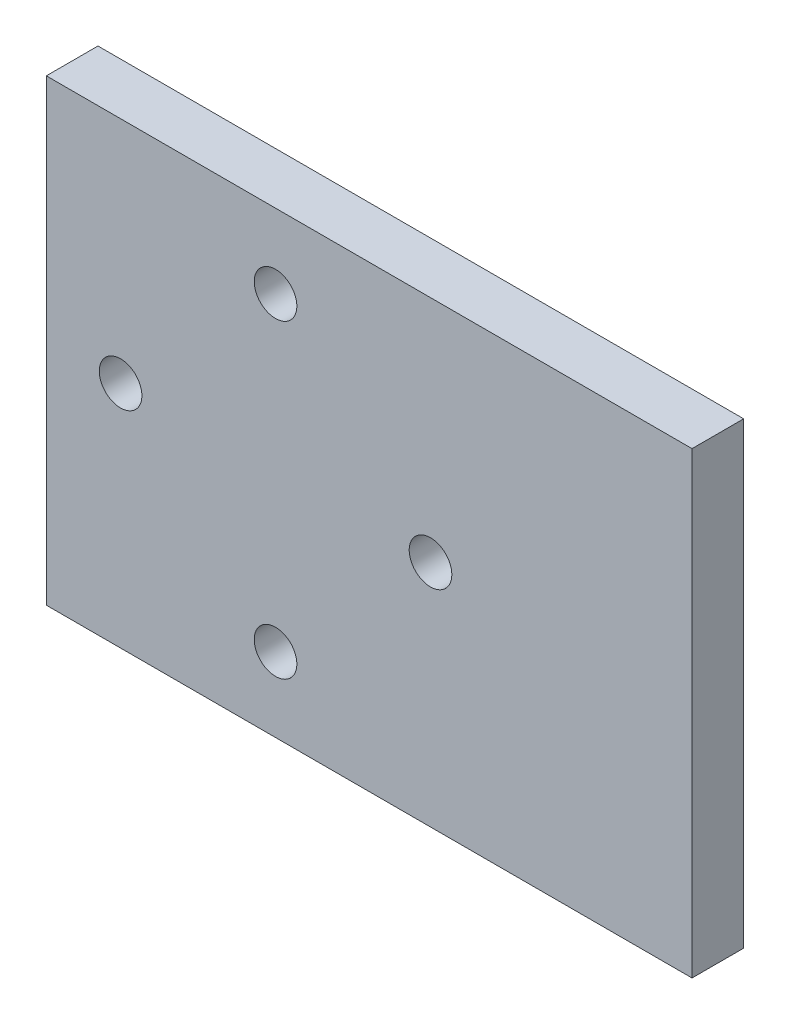
ISO-10303-21;
HEADER;
FILE_DESCRIPTION(('STEP AP214'),'2;1');
FILE_NAME('part.step','',(''),(''),'','','');
FILE_SCHEMA(('AUTOMOTIVE_DESIGN { 1 0 10303 214 1 1 1 1 }'));
ENDSEC;
DATA;
#1=APPLICATION_CONTEXT('core data for automotive mechanical design processes');
#2=APPLICATION_PROTOCOL_DEFINITION('international standard','automotive_design',2000,#1);
#3=PRODUCT_CONTEXT('',#1,'mechanical');
#4=PRODUCT('Part','Part','',(#3));
#5=PRODUCT_RELATED_PRODUCT_CATEGORY('part','',(#4));
#6=PRODUCT_DEFINITION_FORMATION('','',#4);
#7=PRODUCT_DEFINITION_CONTEXT('part definition',#1,'design');
#8=PRODUCT_DEFINITION('design','',#6,#7);
#9=PRODUCT_DEFINITION_SHAPE('','',#8);
#10=(LENGTH_UNIT() NAMED_UNIT(*) SI_UNIT(.MILLI.,.METRE.));
#11=(NAMED_UNIT(*) PLANE_ANGLE_UNIT() SI_UNIT($,.RADIAN.));
#12=(NAMED_UNIT(*) SI_UNIT($,.STERADIAN.) SOLID_ANGLE_UNIT());
#13=UNCERTAINTY_MEASURE_WITH_UNIT(LENGTH_MEASURE(1.E-05),#10,'distance_accuracy_value','');
#14=(GEOMETRIC_REPRESENTATION_CONTEXT(3) GLOBAL_UNCERTAINTY_ASSIGNED_CONTEXT((#13)) GLOBAL_UNIT_ASSIGNED_CONTEXT((#10,
#11,#12)) REPRESENTATION_CONTEXT('',''));
#15=CARTESIAN_POINT('',(0.,0.,0.));
#16=DIRECTION('',(0.,0.,1.));
#17=DIRECTION('',(1.,0.,0.));
#18=AXIS2_PLACEMENT_3D('',#15,#16,#17);
#19=CARTESIAN_POINT('',(50.,35.5,8.));
#20=DIRECTION('',(-1.,0.,0.));
#21=DIRECTION('',(0.,0.,1.));
#22=AXIS2_PLACEMENT_3D('',#19,#20,#21);
#23=PLANE('',#22);
#24=DIRECTION('',(0.,1.,0.));
#25=VECTOR('',#24,1.);
#26=CARTESIAN_POINT('',(50.,35.5,0.));
#27=LINE('',#26,#25);
#28=CARTESIAN_POINT('',(50.,-35.5,0.));
#29=VERTEX_POINT('',#28);
#30=CARTESIAN_POINT('',(50.,35.5,0.));
#31=VERTEX_POINT('',#30);
#32=EDGE_CURVE('E98',#29,#31,#27,.T.);
#33=ORIENTED_EDGE('',*,*,#32,.T.);
#34=DIRECTION('',(0.,0.,-1.));
#35=VECTOR('',#34,1.);
#36=CARTESIAN_POINT('',(50.,35.5,8.));
#37=LINE('',#36,#35);
#38=CARTESIAN_POINT('',(50.,35.5,8.));
#39=VERTEX_POINT('',#38);
#40=EDGE_CURVE('E11',#39,#31,#37,.T.);
#41=ORIENTED_EDGE('',*,*,#40,.F.);
#42=DIRECTION('',(0.,1.,0.));
#43=VECTOR('',#42,1.);
#44=CARTESIAN_POINT('',(50.,35.5,8.));
#45=LINE('',#44,#43);
#46=CARTESIAN_POINT('',(50.,-35.5,8.));
#47=VERTEX_POINT('',#46);
#48=EDGE_CURVE('E86',#47,#39,#45,.T.);
#49=ORIENTED_EDGE('',*,*,#48,.F.);
#50=DIRECTION('',(0.,0.,-1.));
#51=VECTOR('',#50,1.);
#52=CARTESIAN_POINT('',(50.,-35.5,8.));
#53=LINE('',#52,#51);
#54=EDGE_CURVE('E94',#47,#29,#53,.T.);
#55=ORIENTED_EDGE('',*,*,#54,.T.);
#56=EDGE_LOOP('',(#33,#41,#49,#55));
#57=FACE_BOUND('',#56,.T.);
#58=ADVANCED_FACE('F35',(#57),#23,.F.);
#59=CARTESIAN_POINT('',(-50.,35.5,8.));
#60=DIRECTION('',(0.,-1.,0.));
#61=DIRECTION('',(0.,0.,-1.));
#62=AXIS2_PLACEMENT_3D('',#59,#60,#61);
#63=PLANE('',#62);
#64=DIRECTION('',(-1.,0.,0.));
#65=VECTOR('',#64,1.);
#66=CARTESIAN_POINT('',(-50.,35.5,0.));
#67=LINE('',#66,#65);
#68=CARTESIAN_POINT('',(-50.,35.5,0.));
#69=VERTEX_POINT('',#68);
#70=EDGE_CURVE('E90',#31,#69,#67,.T.);
#71=ORIENTED_EDGE('',*,*,#70,.T.);
#72=DIRECTION('',(0.,0.,-1.));
#73=VECTOR('',#72,1.);
#74=CARTESIAN_POINT('',(-50.,35.5,8.));
#75=LINE('',#74,#73);
#76=CARTESIAN_POINT('',(-50.,35.5,8.));
#77=VERTEX_POINT('',#76);
#78=EDGE_CURVE('E43',#77,#69,#75,.T.);
#79=ORIENTED_EDGE('',*,*,#78,.F.);
#80=DIRECTION('',(-1.,0.,0.));
#81=VECTOR('',#80,1.);
#82=CARTESIAN_POINT('',(-50.,35.5,8.));
#83=LINE('',#82,#81);
#84=EDGE_CURVE('E81',#39,#77,#83,.T.);
#85=ORIENTED_EDGE('',*,*,#84,.F.);
#86=ORIENTED_EDGE('',*,*,#40,.T.);
#87=EDGE_LOOP('',(#71,#79,#85,#86));
#88=FACE_BOUND('',#87,.T.);
#89=ADVANCED_FACE('F89',(#88),#63,.F.);
#90=CARTESIAN_POINT('',(-50.,35.5,8.));
#91=DIRECTION('',(1.,0.,0.));
#92=DIRECTION('',(0.,0.,-1.));
#93=AXIS2_PLACEMENT_3D('',#90,#91,#92);
#94=PLANE('',#93);
#95=DIRECTION('',(0.,-1.,0.));
#96=VECTOR('',#95,1.);
#97=CARTESIAN_POINT('',(-50.,35.5,0.));
#98=LINE('',#97,#96);
#99=CARTESIAN_POINT('',(-50.,-35.5,0.));
#100=VERTEX_POINT('',#99);
#101=EDGE_CURVE('E68',#69,#100,#98,.T.);
#102=ORIENTED_EDGE('',*,*,#101,.T.);
#103=DIRECTION('',(0.,0.,-1.));
#104=VECTOR('',#103,1.);
#105=CARTESIAN_POINT('',(-50.,-35.5,8.));
#106=LINE('',#105,#104);
#107=CARTESIAN_POINT('',(-50.,-35.5,8.));
#108=VERTEX_POINT('',#107);
#109=EDGE_CURVE('E91',#108,#100,#106,.T.);
#110=ORIENTED_EDGE('',*,*,#109,.F.);
#111=DIRECTION('',(0.,-1.,0.));
#112=VECTOR('',#111,1.);
#113=CARTESIAN_POINT('',(-50.,35.5,8.));
#114=LINE('',#113,#112);
#115=EDGE_CURVE('E84',#77,#108,#114,.T.);
#116=ORIENTED_EDGE('',*,*,#115,.F.);
#117=ORIENTED_EDGE('',*,*,#78,.T.);
#118=EDGE_LOOP('',(#102,#110,#116,#117));
#119=FACE_BOUND('',#118,.T.);
#120=ADVANCED_FACE('F92',(#119),#94,.F.);
#121=CARTESIAN_POINT('',(-50.,-35.5,8.));
#122=DIRECTION('',(0.,1.,0.));
#123=DIRECTION('',(0.,0.,1.));
#124=AXIS2_PLACEMENT_3D('',#121,#122,#123);
#125=PLANE('',#124);
#126=DIRECTION('',(1.,0.,0.));
#127=VECTOR('',#126,1.);
#128=CARTESIAN_POINT('',(-50.,-35.5,0.));
#129=LINE('',#128,#127);
#130=EDGE_CURVE('E74',#100,#29,#129,.T.);
#131=ORIENTED_EDGE('',*,*,#130,.T.);
#132=ORIENTED_EDGE('',*,*,#54,.F.);
#133=DIRECTION('',(1.,0.,0.));
#134=VECTOR('',#133,1.);
#135=CARTESIAN_POINT('',(-50.,-35.5,8.));
#136=LINE('',#135,#134);
#137=EDGE_CURVE('E51',#108,#47,#136,.T.);
#138=ORIENTED_EDGE('',*,*,#137,.F.);
#139=ORIENTED_EDGE('',*,*,#109,.T.);
#140=EDGE_LOOP('',(#131,#132,#138,#139));
#141=FACE_BOUND('',#140,.T.);
#142=ADVANCED_FACE('F106',(#141),#125,.F.);
#143=CARTESIAN_POINT('',(0.,0.,8.));
#144=DIRECTION('',(0.,0.,1.));
#145=DIRECTION('',(1.,0.,0.));
#146=AXIS2_PLACEMENT_3D('',#143,#144,#145);
#147=PLANE('',#146);
#148=CARTESIAN_POINT('',(-38.5,0.,8.));
#149=DIRECTION('',(0.,0.,1.));
#150=DIRECTION('',(1.,0.,0.));
#151=AXIS2_PLACEMENT_3D('',#148,#149,#150);
#152=CIRCLE('',#151,3.3);
#153=CARTESIAN_POINT('',(-35.2,0.,8.));
#154=VERTEX_POINT('',#153);
#155=EDGE_CURVE('E132',#154,#154,#152,.T.);
#156=ORIENTED_EDGE('',*,*,#155,.F.);
#157=EDGE_LOOP('',(#156));
#158=FACE_BOUND('',#157,.T.);
#159=CARTESIAN_POINT('',(-14.5,-24.,8.));
#160=DIRECTION('',(0.,0.,1.));
#161=DIRECTION('',(1.,0.,0.));
#162=AXIS2_PLACEMENT_3D('',#159,#160,#161);
#163=CIRCLE('',#162,3.3);
#164=CARTESIAN_POINT('',(-11.2,-24.,8.));
#165=VERTEX_POINT('',#164);
#166=EDGE_CURVE('E126',#165,#165,#163,.T.);
#167=ORIENTED_EDGE('',*,*,#166,.F.);
#168=EDGE_LOOP('',(#167));
#169=FACE_BOUND('',#168,.T.);
#170=CARTESIAN_POINT('',(9.5,0.,8.));
#171=DIRECTION('',(0.,0.,1.));
#172=DIRECTION('',(1.,0.,0.));
#173=AXIS2_PLACEMENT_3D('',#170,#171,#172);
#174=CIRCLE('',#173,3.3);
#175=CARTESIAN_POINT('',(12.8,0.,8.));
#176=VERTEX_POINT('',#175);
#177=EDGE_CURVE('E120',#176,#176,#174,.T.);
#178=ORIENTED_EDGE('',*,*,#177,.F.);
#179=EDGE_LOOP('',(#178));
#180=FACE_BOUND('',#179,.T.);
#181=CARTESIAN_POINT('',(-14.5,24.,8.));
#182=DIRECTION('',(0.,0.,1.));
#183=DIRECTION('',(1.,0.,0.));
#184=AXIS2_PLACEMENT_3D('',#181,#182,#183);
#185=CIRCLE('',#184,3.3);
#186=CARTESIAN_POINT('',(-11.2,24.,8.));
#187=VERTEX_POINT('',#186);
#188=EDGE_CURVE('E114',#187,#187,#185,.T.);
#189=ORIENTED_EDGE('',*,*,#188,.F.);
#190=EDGE_LOOP('',(#189));
#191=FACE_BOUND('',#190,.T.);
#192=ORIENTED_EDGE('',*,*,#48,.T.);
#193=ORIENTED_EDGE('',*,*,#84,.T.);
#194=ORIENTED_EDGE('',*,*,#115,.T.);
#195=ORIENTED_EDGE('',*,*,#137,.T.);
#196=EDGE_LOOP('',(#192,#193,#194,#195));
#197=FACE_BOUND('',#196,.T.);
#198=ADVANCED_FACE('F82',(#158,#169,#180,#191,#197),#147,.T.);
#199=CARTESIAN_POINT('',(0.,0.,0.));
#200=DIRECTION('',(0.,0.,1.));
#201=DIRECTION('',(1.,0.,0.));
#202=AXIS2_PLACEMENT_3D('',#199,#200,#201);
#203=PLANE('',#202);
#204=CARTESIAN_POINT('',(-38.5,0.,0.));
#205=DIRECTION('',(0.,0.,1.));
#206=DIRECTION('',(1.,0.,0.));
#207=AXIS2_PLACEMENT_3D('',#204,#205,#206);
#208=CIRCLE('',#207,3.3);
#209=CARTESIAN_POINT('',(-35.2,0.,0.));
#210=VERTEX_POINT('',#209);
#211=EDGE_CURVE('E129',#210,#210,#208,.T.);
#212=ORIENTED_EDGE('',*,*,#211,.T.);
#213=EDGE_LOOP('',(#212));
#214=FACE_BOUND('',#213,.T.);
#215=CARTESIAN_POINT('',(-14.5,-24.,0.));
#216=DIRECTION('',(0.,0.,1.));
#217=DIRECTION('',(1.,0.,0.));
#218=AXIS2_PLACEMENT_3D('',#215,#216,#217);
#219=CIRCLE('',#218,3.3);
#220=CARTESIAN_POINT('',(-11.2,-24.,0.));
#221=VERTEX_POINT('',#220);
#222=EDGE_CURVE('E123',#221,#221,#219,.T.);
#223=ORIENTED_EDGE('',*,*,#222,.T.);
#224=EDGE_LOOP('',(#223));
#225=FACE_BOUND('',#224,.T.);
#226=CARTESIAN_POINT('',(9.5,0.,0.));
#227=DIRECTION('',(0.,0.,1.));
#228=DIRECTION('',(1.,0.,0.));
#229=AXIS2_PLACEMENT_3D('',#226,#227,#228);
#230=CIRCLE('',#229,3.3);
#231=CARTESIAN_POINT('',(12.8,0.,0.));
#232=VERTEX_POINT('',#231);
#233=EDGE_CURVE('E117',#232,#232,#230,.T.);
#234=ORIENTED_EDGE('',*,*,#233,.T.);
#235=EDGE_LOOP('',(#234));
#236=FACE_BOUND('',#235,.T.);
#237=CARTESIAN_POINT('',(-14.5,24.,0.));
#238=DIRECTION('',(0.,0.,1.));
#239=DIRECTION('',(1.,0.,0.));
#240=AXIS2_PLACEMENT_3D('',#237,#238,#239);
#241=CIRCLE('',#240,3.3);
#242=CARTESIAN_POINT('',(-11.2,24.,0.));
#243=VERTEX_POINT('',#242);
#244=EDGE_CURVE('E101',#243,#243,#241,.T.);
#245=ORIENTED_EDGE('',*,*,#244,.T.);
#246=EDGE_LOOP('',(#245));
#247=FACE_BOUND('',#246,.T.);
#248=ORIENTED_EDGE('',*,*,#32,.F.);
#249=ORIENTED_EDGE('',*,*,#130,.F.);
#250=ORIENTED_EDGE('',*,*,#101,.F.);
#251=ORIENTED_EDGE('',*,*,#70,.F.);
#252=EDGE_LOOP('',(#248,#249,#250,#251));
#253=FACE_BOUND('',#252,.T.);
#254=ADVANCED_FACE('F109',(#214,#225,#236,#247,#253),#203,.F.);
#255=CARTESIAN_POINT('',(-14.5,24.,8.));
#256=DIRECTION('',(0.,0.,1.));
#257=DIRECTION('',(1.,0.,0.));
#258=AXIS2_PLACEMENT_3D('',#255,#256,#257);
#259=CYLINDRICAL_SURFACE('',#258,3.3);
#260=ORIENTED_EDGE('',*,*,#244,.F.);
#261=EDGE_LOOP('',(#260));
#262=FACE_BOUND('',#261,.T.);
#263=ORIENTED_EDGE('',*,*,#188,.T.);
#264=EDGE_LOOP('',(#263));
#265=FACE_BOUND('',#264,.T.);
#266=ADVANCED_FACE('F147',(#262,#265),#259,.F.);
#267=CARTESIAN_POINT('',(9.5,0.,8.));
#268=DIRECTION('',(0.,0.,1.));
#269=DIRECTION('',(1.,0.,0.));
#270=AXIS2_PLACEMENT_3D('',#267,#268,#269);
#271=CYLINDRICAL_SURFACE('',#270,3.3);
#272=ORIENTED_EDGE('',*,*,#233,.F.);
#273=EDGE_LOOP('',(#272));
#274=FACE_BOUND('',#273,.T.);
#275=ORIENTED_EDGE('',*,*,#177,.T.);
#276=EDGE_LOOP('',(#275));
#277=FACE_BOUND('',#276,.T.);
#278=ADVANCED_FACE('F149',(#274,#277),#271,.F.);
#279=CARTESIAN_POINT('',(-14.5,-24.,8.));
#280=DIRECTION('',(0.,0.,1.));
#281=DIRECTION('',(1.,0.,0.));
#282=AXIS2_PLACEMENT_3D('',#279,#280,#281);
#283=CYLINDRICAL_SURFACE('',#282,3.3);
#284=ORIENTED_EDGE('',*,*,#222,.F.);
#285=EDGE_LOOP('',(#284));
#286=FACE_BOUND('',#285,.T.);
#287=ORIENTED_EDGE('',*,*,#166,.T.);
#288=EDGE_LOOP('',(#287));
#289=FACE_BOUND('',#288,.T.);
#290=ADVANCED_FACE('F156',(#286,#289),#283,.F.);
#291=CARTESIAN_POINT('',(-38.5,0.,8.));
#292=DIRECTION('',(0.,0.,1.));
#293=DIRECTION('',(1.,0.,0.));
#294=AXIS2_PLACEMENT_3D('',#291,#292,#293);
#295=CYLINDRICAL_SURFACE('',#294,3.3);
#296=ORIENTED_EDGE('',*,*,#211,.F.);
#297=EDGE_LOOP('',(#296));
#298=FACE_BOUND('',#297,.T.);
#299=ORIENTED_EDGE('',*,*,#155,.T.);
#300=EDGE_LOOP('',(#299));
#301=FACE_BOUND('',#300,.T.);
#302=ADVANCED_FACE('F136',(#298,#301),#295,.F.);
#303=CLOSED_SHELL('',(#58,#89,#120,#142,#198,#254,#266,#278,#290,#302));
#304=MANIFOLD_SOLID_BREP('B2',#303);
#305=ADVANCED_BREP_SHAPE_REPRESENTATION('',(#18,#304),#14);
#306=SHAPE_DEFINITION_REPRESENTATION(#9,#305);
ENDSEC;
END-ISO-10303-21;
